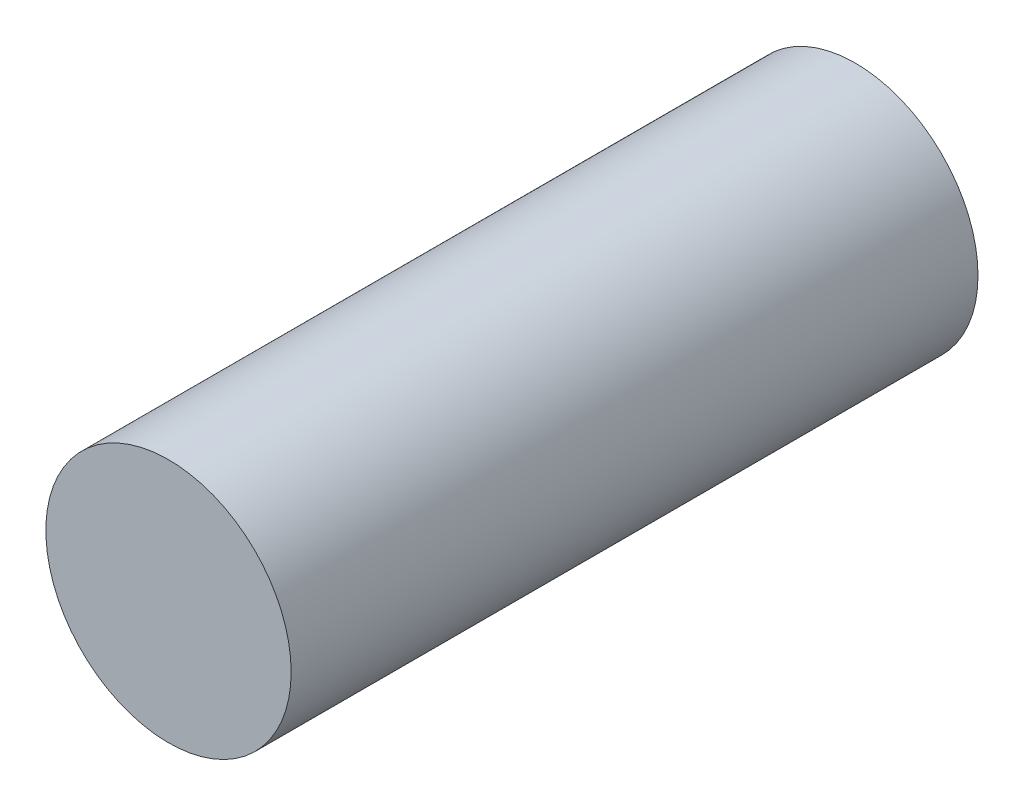
ISO-10303-21;
HEADER;
FILE_DESCRIPTION(('STEP AP214'),'2;1');
FILE_NAME('part.step','',(''),(''),'','','');
FILE_SCHEMA(('AUTOMOTIVE_DESIGN { 1 0 10303 214 1 1 1 1 }'));
ENDSEC;
DATA;
#1=APPLICATION_CONTEXT('core data for automotive mechanical design processes');
#2=APPLICATION_PROTOCOL_DEFINITION('international standard','automotive_design',2000,#1);
#3=PRODUCT_CONTEXT('',#1,'mechanical');
#4=PRODUCT('Part','Part','',(#3));
#5=PRODUCT_RELATED_PRODUCT_CATEGORY('part','',(#4));
#6=PRODUCT_DEFINITION_FORMATION('','',#4);
#7=PRODUCT_DEFINITION_CONTEXT('part definition',#1,'design');
#8=PRODUCT_DEFINITION('design','',#6,#7);
#9=PRODUCT_DEFINITION_SHAPE('','',#8);
#10=(LENGTH_UNIT() NAMED_UNIT(*) SI_UNIT(.MILLI.,.METRE.));
#11=(NAMED_UNIT(*) PLANE_ANGLE_UNIT() SI_UNIT($,.RADIAN.));
#12=(NAMED_UNIT(*) SI_UNIT($,.STERADIAN.) SOLID_ANGLE_UNIT());
#13=UNCERTAINTY_MEASURE_WITH_UNIT(LENGTH_MEASURE(1.E-05),#10,'distance_accuracy_value','');
#14=(GEOMETRIC_REPRESENTATION_CONTEXT(3) GLOBAL_UNCERTAINTY_ASSIGNED_CONTEXT((#13)) GLOBAL_UNIT_ASSIGNED_CONTEXT((#10,
#11,#12)) REPRESENTATION_CONTEXT('',''));
#15=CARTESIAN_POINT('',(0.,0.,0.));
#16=DIRECTION('',(0.,0.,1.));
#17=DIRECTION('',(1.,0.,0.));
#18=AXIS2_PLACEMENT_3D('',#15,#16,#17);
#19=CARTESIAN_POINT('',(0.,0.,14.));
#20=DIRECTION('',(0.,0.,-1.));
#21=DIRECTION('',(-1.,0.,0.));
#22=AXIS2_PLACEMENT_3D('',#19,#20,#21);
#23=CYLINDRICAL_SURFACE('',#22,2.5);
#24=CARTESIAN_POINT('',(0.,0.,14.));
#25=DIRECTION('',(0.,0.,1.));
#26=DIRECTION('',(1.,0.,0.));
#27=AXIS2_PLACEMENT_3D('',#24,#25,#26);
#28=CIRCLE('',#27,2.5);
#29=CARTESIAN_POINT('',(2.5,0.,14.));
#30=VERTEX_POINT('',#29);
#31=EDGE_CURVE('E10',#30,#30,#28,.T.);
#32=ORIENTED_EDGE('',*,*,#31,.F.);
#33=EDGE_LOOP('',(#32));
#34=FACE_BOUND('',#33,.T.);
#35=CARTESIAN_POINT('',(0.,0.,0.));
#36=DIRECTION('',(0.,0.,1.));
#37=DIRECTION('',(1.,0.,0.));
#38=AXIS2_PLACEMENT_3D('',#35,#36,#37);
#39=CIRCLE('',#38,2.5);
#40=CARTESIAN_POINT('',(2.5,0.,0.));
#41=VERTEX_POINT('',#40);
#42=EDGE_CURVE('E34',#41,#41,#39,.T.);
#43=ORIENTED_EDGE('',*,*,#42,.T.);
#44=EDGE_LOOP('',(#43));
#45=FACE_BOUND('',#44,.T.);
#46=ADVANCED_FACE('F31',(#34,#45),#23,.T.);
#47=CARTESIAN_POINT('',(0.,0.,14.));
#48=DIRECTION('',(0.,0.,1.));
#49=DIRECTION('',(1.,0.,0.));
#50=AXIS2_PLACEMENT_3D('',#47,#48,#49);
#51=PLANE('',#50);
#52=ORIENTED_EDGE('',*,*,#31,.T.);
#53=EDGE_LOOP('',(#52));
#54=FACE_BOUND('',#53,.T.);
#55=ADVANCED_FACE('F46',(#54),#51,.T.);
#56=CARTESIAN_POINT('',(0.,0.,0.));
#57=DIRECTION('',(0.,0.,1.));
#58=DIRECTION('',(1.,0.,0.));
#59=AXIS2_PLACEMENT_3D('',#56,#57,#58);
#60=PLANE('',#59);
#61=ORIENTED_EDGE('',*,*,#42,.F.);
#62=EDGE_LOOP('',(#61));
#63=FACE_BOUND('',#62,.T.);
#64=ADVANCED_FACE('F44',(#63),#60,.F.);
#65=CLOSED_SHELL('',(#46,#55,#64));
#66=MANIFOLD_SOLID_BREP('B2',#65);
#67=ADVANCED_BREP_SHAPE_REPRESENTATION('',(#18,#66),#14);
#68=SHAPE_DEFINITION_REPRESENTATION(#9,#67);
ENDSEC;
END-ISO-10303-21;
